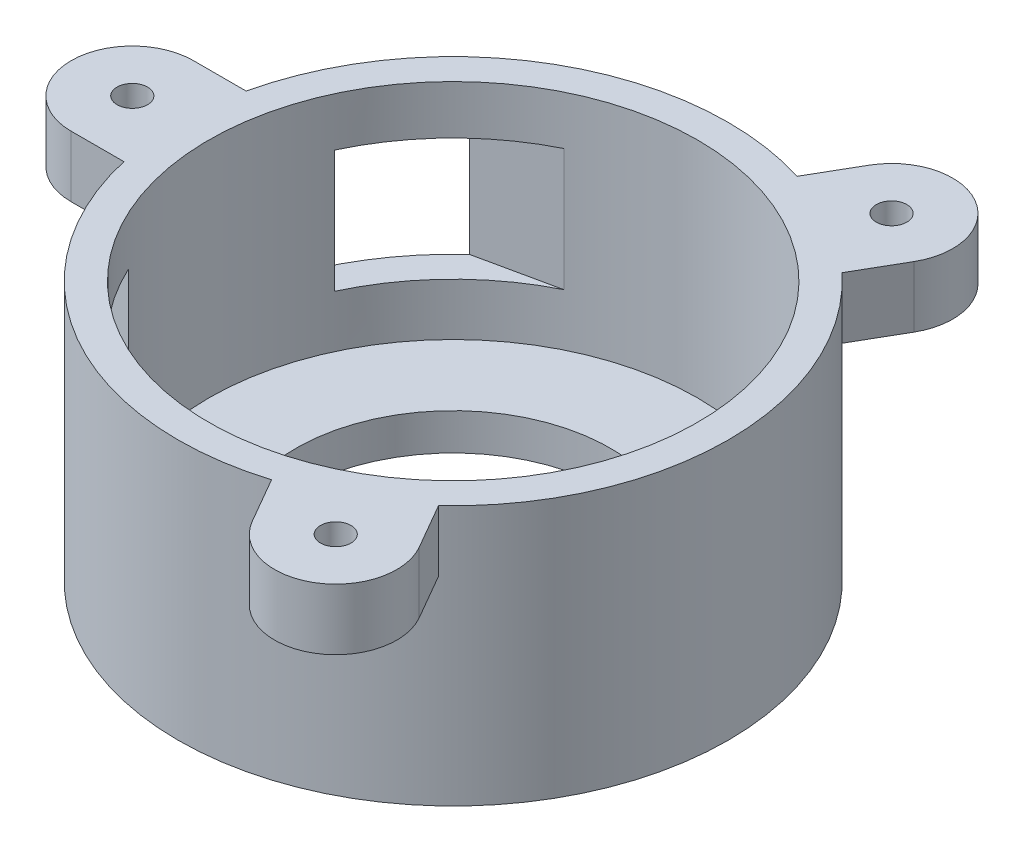
ISO-10303-21;
HEADER;
FILE_DESCRIPTION(('STEP AP214'),'2;1');
FILE_NAME('part.step','',(''),(''),'','','');
FILE_SCHEMA(('AUTOMOTIVE_DESIGN { 1 0 10303 214 1 1 1 1 }'));
ENDSEC;
DATA;
#1=APPLICATION_CONTEXT('core data for automotive mechanical design processes');
#2=APPLICATION_PROTOCOL_DEFINITION('international standard','automotive_design',2000,#1);
#3=PRODUCT_CONTEXT('',#1,'mechanical');
#4=PRODUCT('Part','Part','',(#3));
#5=PRODUCT_RELATED_PRODUCT_CATEGORY('part','',(#4));
#6=PRODUCT_DEFINITION_FORMATION('','',#4);
#7=PRODUCT_DEFINITION_CONTEXT('part definition',#1,'design');
#8=PRODUCT_DEFINITION('design','',#6,#7);
#9=PRODUCT_DEFINITION_SHAPE('','',#8);
#10=(LENGTH_UNIT() NAMED_UNIT(*) SI_UNIT(.MILLI.,.METRE.));
#11=(NAMED_UNIT(*) PLANE_ANGLE_UNIT() SI_UNIT($,.RADIAN.));
#12=(NAMED_UNIT(*) SI_UNIT($,.STERADIAN.) SOLID_ANGLE_UNIT());
#13=UNCERTAINTY_MEASURE_WITH_UNIT(LENGTH_MEASURE(1.E-05),#10,'distance_accuracy_value','');
#14=(GEOMETRIC_REPRESENTATION_CONTEXT(3) GLOBAL_UNCERTAINTY_ASSIGNED_CONTEXT((#13)) GLOBAL_UNIT_ASSIGNED_CONTEXT((#10,
#11,#12)) REPRESENTATION_CONTEXT('',''));
#15=CARTESIAN_POINT('',(0.,0.,0.));
#16=DIRECTION('',(0.,0.,1.));
#17=DIRECTION('',(1.,0.,0.));
#18=AXIS2_PLACEMENT_3D('',#15,#16,#17);
#19=CARTESIAN_POINT('',(-20.,140.,120.));
#20=DIRECTION('',(0.,-1.,0.));
#21=DIRECTION('',(0.,0.,-1.));
#22=AXIS2_PLACEMENT_3D('',#19,#20,#21);
#23=PLANE('',#22);
#24=CARTESIAN_POINT('',(-80.,140.,60.));
#25=DIRECTION('',(0.,1.,0.));
#26=DIRECTION('',(0.,0.,1.));
#27=AXIS2_PLACEMENT_3D('',#24,#25,#26);
#28=CIRCLE('',#27,45.);
#29=CARTESIAN_POINT('',(-66.7228430693652,140.,17.003289616073));
#30=VERTEX_POINT('',#29);
#31=CARTESIAN_POINT('',(-123.874821936961,140.,50.));
#32=VERTEX_POINT('',#31);
#33=EDGE_CURVE('E40',#30,#32,#28,.T.);
#34=ORIENTED_EDGE('',*,*,#33,.T.);
#35=DIRECTION('',(-1.,0.,0.));
#36=VECTOR('',#35,1.);
#37=CARTESIAN_POINT('',(0.,140.,50.));
#38=LINE('',#37,#36);
#39=CARTESIAN_POINT('',(-132.5,140.,50.));
#40=VERTEX_POINT('',#39);
#41=EDGE_CURVE('E212',#32,#40,#38,.T.);
#42=ORIENTED_EDGE('',*,*,#41,.T.);
#43=CARTESIAN_POINT('',(-132.5,140.,60.));
#44=DIRECTION('',(0.,1.,0.));
#45=DIRECTION('',(0.,0.,1.));
#46=AXIS2_PLACEMENT_3D('',#43,#44,#45);
#47=CIRCLE('',#46,9.99999999999999);
#48=CARTESIAN_POINT('',(-132.5,140.,70.));
#49=VERTEX_POINT('',#48);
#50=EDGE_CURVE('E182',#40,#49,#47,.T.);
#51=ORIENTED_EDGE('',*,*,#50,.T.);
#52=DIRECTION('',(-1.,0.,0.));
#53=VECTOR('',#52,1.);
#54=CARTESIAN_POINT('',(0.,140.,70.0000000000001));
#55=LINE('',#54,#53);
#56=CARTESIAN_POINT('',(-123.874821936961,140.,70.));
#57=VERTEX_POINT('',#56);
#58=EDGE_CURVE('E204',#57,#49,#55,.T.);
#59=ORIENTED_EDGE('',*,*,#58,.F.);
#60=CARTESIAN_POINT('',(-66.7228430693627,140.,102.996710383926));
#61=VERTEX_POINT('',#60);
#62=EDGE_CURVE('E721',#57,#61,#28,.T.);
#63=ORIENTED_EDGE('',*,*,#62,.T.);
#64=DIRECTION('',(0.499999999999992,0.,0.866025403784444));
#65=VECTOR('',#64,1.);
#66=CARTESIAN_POINT('',(-94.6410161513764,140.,54.6410161513756));
#67=LINE('',#66,#65);
#68=CARTESIAN_POINT('',(-62.4102540378435,140.,110.466333698682));
#69=VERTEX_POINT('',#68);
#70=EDGE_CURVE('E238',#61,#69,#67,.T.);
#71=ORIENTED_EDGE('',*,*,#70,.T.);
#72=CARTESIAN_POINT('',(-53.7499999999991,140.,105.466333698682));
#73=DIRECTION('',(0.,1.,0.));
#74=DIRECTION('',(0.,0.,1.));
#75=AXIS2_PLACEMENT_3D('',#72,#73,#74);
#76=CIRCLE('',#75,9.99999999999999);
#77=CARTESIAN_POINT('',(-45.0897459621547,140.,100.466333698682));
#78=VERTEX_POINT('',#77);
#79=EDGE_CURVE('E241',#69,#78,#76,.T.);
#80=ORIENTED_EDGE('',*,*,#79,.T.);
#81=DIRECTION('',(0.49999999999999,0.,0.866025403784445));
#82=VECTOR('',#81,1.);
#83=CARTESIAN_POINT('',(-77.3205080756875,140.,44.6410161513756));
#84=LINE('',#83,#82);
#85=CARTESIAN_POINT('',(-49.4023349936742,140.,92.9967103839256));
#86=VERTEX_POINT('',#85);
#87=EDGE_CURVE('E224',#86,#78,#84,.T.);
#88=ORIENTED_EDGE('',*,*,#87,.F.);
#89=CARTESIAN_POINT('',(-49.4023349936762,140.,27.0032896160725));
#90=VERTEX_POINT('',#89);
#91=EDGE_CURVE('E282',#86,#90,#28,.T.);
#92=ORIENTED_EDGE('',*,*,#91,.T.);
#93=DIRECTION('',(0.500000000000004,0.,-0.866025403784437));
#94=VECTOR('',#93,1.);
#95=CARTESIAN_POINT('',(-25.3589838486232,140.,-14.6410161513781));
#96=LINE('',#95,#94);
#97=CARTESIAN_POINT('',(-45.0897459621559,140.,19.5336663013153));
#98=VERTEX_POINT('',#97);
#99=EDGE_CURVE('E271',#90,#98,#96,.T.);
#100=ORIENTED_EDGE('',*,*,#99,.T.);
#101=CARTESIAN_POINT('',(-53.7500000000003,140.,14.5336663013152));
#102=DIRECTION('',(0.,1.,0.));
#103=DIRECTION('',(0.,0.,1.));
#104=AXIS2_PLACEMENT_3D('',#101,#102,#103);
#105=CIRCLE('',#104,9.99999999999999);
#106=CARTESIAN_POINT('',(-62.4102540378447,140.,9.5336663013152));
#107=VERTEX_POINT('',#106);
#108=EDGE_CURVE('E274',#98,#107,#105,.T.);
#109=ORIENTED_EDGE('',*,*,#108,.T.);
#110=DIRECTION('',(0.500000000000005,0.,-0.866025403784436));
#111=VECTOR('',#110,1.);
#112=CARTESIAN_POINT('',(-42.6794919243119,140.,-24.6410161513782));
#113=LINE('',#112,#111);
#114=EDGE_CURVE('E257',#30,#107,#113,.T.);
#115=ORIENTED_EDGE('',*,*,#114,.F.);
#116=EDGE_LOOP('',(#34,#42,#51,#59,#63,#71,#80,#88,#92,#100,#109,#115));
#117=FACE_BOUND('',#116,.T.);
#118=CARTESIAN_POINT('',(-80.,140.,60.));
#119=DIRECTION('',(0.,-1.,0.));
#120=DIRECTION('',(0.,0.,-1.));
#121=AXIS2_PLACEMENT_3D('',#118,#119,#120);
#122=CIRCLE('',#121,40.);
#123=CARTESIAN_POINT('',(-80.,140.,20.));
#124=VERTEX_POINT('',#123);
#125=EDGE_CURVE('E288',#124,#124,#122,.F.);
#126=ORIENTED_EDGE('',*,*,#125,.F.);
#127=EDGE_LOOP('',(#126));
#128=FACE_BOUND('',#127,.T.);
#129=CARTESIAN_POINT('',(-53.7500000000003,140.,14.5336663013152));
#130=DIRECTION('',(0.,1.,0.));
#131=DIRECTION('',(0.,0.,1.));
#132=AXIS2_PLACEMENT_3D('',#129,#130,#131);
#133=CIRCLE('',#132,2.49999999999997);
#134=CARTESIAN_POINT('',(-53.7500000000003,140.,17.0336663013152));
#135=VERTEX_POINT('',#134);
#136=EDGE_CURVE('E248',#135,#135,#133,.T.);
#137=ORIENTED_EDGE('',*,*,#136,.F.);
#138=EDGE_LOOP('',(#137));
#139=FACE_BOUND('',#138,.T.);
#140=CARTESIAN_POINT('',(-53.7499999999991,140.,105.466333698682));
#141=DIRECTION('',(0.,1.,0.));
#142=DIRECTION('',(0.,0.,1.));
#143=AXIS2_PLACEMENT_3D('',#140,#141,#142);
#144=CIRCLE('',#143,2.49999999999999);
#145=CARTESIAN_POINT('',(-53.7499999999991,140.,107.966333698682));
#146=VERTEX_POINT('',#145);
#147=EDGE_CURVE('E217',#146,#146,#144,.T.);
#148=ORIENTED_EDGE('',*,*,#147,.F.);
#149=EDGE_LOOP('',(#148));
#150=FACE_BOUND('',#149,.T.);
#151=CARTESIAN_POINT('',(-132.5,140.,60.));
#152=DIRECTION('',(0.,1.,0.));
#153=DIRECTION('',(0.,0.,1.));
#154=AXIS2_PLACEMENT_3D('',#151,#152,#153);
#155=CIRCLE('',#154,2.49999999999999);
#156=CARTESIAN_POINT('',(-132.5,140.,62.5));
#157=VERTEX_POINT('',#156);
#158=EDGE_CURVE('E209',#157,#157,#155,.T.);
#159=ORIENTED_EDGE('',*,*,#158,.F.);
#160=EDGE_LOOP('',(#159));
#161=FACE_BOUND('',#160,.T.);
#162=ADVANCED_FACE('F37',(#117,#128,#139,#150,#161),#23,.F.);
#163=CARTESIAN_POINT('',(-80.,165.,60.));
#164=DIRECTION('',(0.,-1.,0.));
#165=DIRECTION('',(0.,0.,-1.));
#166=AXIS2_PLACEMENT_3D('',#163,#164,#165);
#167=CYLINDRICAL_SURFACE('',#166,40.);
#168=ORIENTED_EDGE('',*,*,#125,.T.);
#169=EDGE_LOOP('',(#168));
#170=FACE_BOUND('',#169,.T.);
#171=DIRECTION('',(0.,-1.,0.));
#172=VECTOR('',#171,1.);
#173=CARTESIAN_POINT('',(-97.74561888015,165.,24.1518060348856));
#174=LINE('',#173,#172);
#175=CARTESIAN_POINT('',(-97.7456188801501,112.,24.1518060348856));
#176=VERTEX_POINT('',#175);
#177=CARTESIAN_POINT('',(-97.7456188801501,132.,24.1518060348856));
#178=VERTEX_POINT('',#177);
#179=EDGE_CURVE('E344',#176,#178,#174,.F.);
#180=ORIENTED_EDGE('',*,*,#179,.F.);
#181=CARTESIAN_POINT('',(-80.,112.,60.));
#182=DIRECTION('',(0.,1.,0.));
#183=DIRECTION('',(0.,0.,1.));
#184=AXIS2_PLACEMENT_3D('',#181,#182,#183);
#185=CIRCLE('',#184,40.);
#186=CARTESIAN_POINT('',(-116.266630075089,112.,43.1260098673539));
#187=VERTEX_POINT('',#186);
#188=EDGE_CURVE('E347',#187,#176,#185,.F.);
#189=ORIENTED_EDGE('',*,*,#188,.F.);
#190=DIRECTION('',(0.,-1.,0.));
#191=VECTOR('',#190,1.);
#192=CARTESIAN_POINT('',(-116.266630075089,165.,43.1260098673539));
#193=LINE('',#192,#191);
#194=CARTESIAN_POINT('',(-116.266630075089,132.,43.1260098673539));
#195=VERTEX_POINT('',#194);
#196=EDGE_CURVE('E350',#195,#187,#193,.T.);
#197=ORIENTED_EDGE('',*,*,#196,.F.);
#198=CARTESIAN_POINT('',(-80.,132.,60.));
#199=DIRECTION('',(0.,-1.,0.));
#200=DIRECTION('',(0.,0.,-1.));
#201=AXIS2_PLACEMENT_3D('',#198,#199,#200);
#202=CIRCLE('',#201,40.);
#203=EDGE_CURVE('E355',#178,#195,#202,.F.);
#204=ORIENTED_EDGE('',*,*,#203,.F.);
#205=EDGE_LOOP('',(#180,#189,#197,#204));
#206=FACE_BOUND('',#205,.T.);
#207=CARTESIAN_POINT('',(-80.,103.450277264636,60.));
#208=DIRECTION('',(0.,1.,0.));
#209=DIRECTION('',(0.,0.,1.));
#210=AXIS2_PLACEMENT_3D('',#207,#208,#209);
#211=CIRCLE('',#210,40.);
#212=CARTESIAN_POINT('',(-80.,103.450277264636,100.));
#213=VERTEX_POINT('',#212);
#214=EDGE_CURVE('E312',#213,#213,#211,.T.);
#215=ORIENTED_EDGE('',*,*,#214,.F.);
#216=EDGE_LOOP('',(#215));
#217=FACE_BOUND('',#216,.T.);
#218=CARTESIAN_POINT('',(-80.,132.,60.));
#219=DIRECTION('',(0.,-1.,0.));
#220=DIRECTION('',(0.,0.,-1.));
#221=AXIS2_PLACEMENT_3D('',#218,#219,#220);
#222=CIRCLE('',#221,40.);
#223=CARTESIAN_POINT('',(-116.266630075089,132.,76.8739901326458));
#224=VERTEX_POINT('',#223);
#225=CARTESIAN_POINT('',(-97.7456188801504,132.,95.8481939651142));
#226=VERTEX_POINT('',#225);
#227=EDGE_CURVE('E321',#224,#226,#222,.F.);
#228=ORIENTED_EDGE('',*,*,#227,.F.);
#229=DIRECTION('',(0.,-1.,0.));
#230=VECTOR('',#229,1.);
#231=CARTESIAN_POINT('',(-116.266630075089,165.,76.8739901326458));
#232=LINE('',#231,#230);
#233=CARTESIAN_POINT('',(-116.266630075089,112.,76.8739901326458));
#234=VERTEX_POINT('',#233);
#235=EDGE_CURVE('E348',#234,#224,#232,.F.);
#236=ORIENTED_EDGE('',*,*,#235,.F.);
#237=CARTESIAN_POINT('',(-80.,112.,60.));
#238=DIRECTION('',(0.,1.,0.));
#239=DIRECTION('',(0.,0.,1.));
#240=AXIS2_PLACEMENT_3D('',#237,#238,#239);
#241=CIRCLE('',#240,40.);
#242=CARTESIAN_POINT('',(-97.7456188801504,112.,95.8481939651142));
#243=VERTEX_POINT('',#242);
#244=EDGE_CURVE('E325',#243,#234,#241,.F.);
#245=ORIENTED_EDGE('',*,*,#244,.F.);
#246=DIRECTION('',(0.,-1.,0.));
#247=VECTOR('',#246,1.);
#248=CARTESIAN_POINT('',(-97.7456188801504,165.,95.8481939651142));
#249=LINE('',#248,#247);
#250=EDGE_CURVE('E323',#226,#243,#249,.T.);
#251=ORIENTED_EDGE('',*,*,#250,.F.);
#252=EDGE_LOOP('',(#228,#236,#245,#251));
#253=FACE_BOUND('',#252,.T.);
#254=ADVANCED_FACE('F387',(#170,#206,#217,#253),#167,.F.);
#255=CARTESIAN_POINT('',(-80.,160.,60.));
#256=DIRECTION('',(0.,1.,0.));
#257=DIRECTION('',(0.,0.,1.));
#258=AXIS2_PLACEMENT_3D('',#255,#256,#257);
#259=CYLINDRICAL_SURFACE('',#258,45.);
#260=CARTESIAN_POINT('',(-80.,130.,60.));
#261=DIRECTION('',(0.,1.,0.));
#262=DIRECTION('',(0.,0.,1.));
#263=AXIS2_PLACEMENT_3D('',#260,#261,#262);
#264=CIRCLE('',#263,45.);
#265=CARTESIAN_POINT('',(-123.874821936961,130.,50.));
#266=VERTEX_POINT('',#265);
#267=CARTESIAN_POINT('',(-123.874821936961,130.,70.));
#268=VERTEX_POINT('',#267);
#269=EDGE_CURVE('E187',#266,#268,#264,.T.);
#270=ORIENTED_EDGE('',*,*,#269,.F.);
#271=DIRECTION('',(0.,1.,0.));
#272=VECTOR('',#271,1.);
#273=CARTESIAN_POINT('',(-123.874821936961,130.,50.));
#274=LINE('',#273,#272);
#275=EDGE_CURVE('E200',#266,#32,#274,.T.);
#276=ORIENTED_EDGE('',*,*,#275,.T.);
#277=ORIENTED_EDGE('',*,*,#33,.F.);
#278=DIRECTION('',(0.,1.,0.));
#279=VECTOR('',#278,1.);
#280=CARTESIAN_POINT('',(-66.7228430693652,130.,17.003289616073));
#281=LINE('',#280,#279);
#282=CARTESIAN_POINT('',(-66.7228430693652,130.,17.003289616073));
#283=VERTEX_POINT('',#282);
#284=EDGE_CURVE('E283',#283,#30,#281,.T.);
#285=ORIENTED_EDGE('',*,*,#284,.F.);
#286=CARTESIAN_POINT('',(-80.,130.,60.));
#287=DIRECTION('',(0.,1.,0.));
#288=DIRECTION('',(0.,0.,1.));
#289=AXIS2_PLACEMENT_3D('',#286,#287,#288);
#290=CIRCLE('',#289,45.);
#291=CARTESIAN_POINT('',(-49.4023349936762,130.,27.0032896160725));
#292=VERTEX_POINT('',#291);
#293=EDGE_CURVE('E265',#292,#283,#290,.T.);
#294=ORIENTED_EDGE('',*,*,#293,.F.);
#295=DIRECTION('',(0.,1.,0.));
#296=VECTOR('',#295,1.);
#297=CARTESIAN_POINT('',(-49.4023349936762,130.,27.0032896160725));
#298=LINE('',#297,#296);
#299=EDGE_CURVE('E279',#292,#90,#298,.T.);
#300=ORIENTED_EDGE('',*,*,#299,.T.);
#301=ORIENTED_EDGE('',*,*,#91,.F.);
#302=DIRECTION('',(0.,1.,0.));
#303=VECTOR('',#302,1.);
#304=CARTESIAN_POINT('',(-49.4023349936742,130.,92.9967103839256));
#305=LINE('',#304,#303);
#306=CARTESIAN_POINT('',(-49.4023349936742,130.,92.9967103839256));
#307=VERTEX_POINT('',#306);
#308=EDGE_CURVE('E61',#307,#86,#305,.T.);
#309=ORIENTED_EDGE('',*,*,#308,.F.);
#310=CARTESIAN_POINT('',(-80.,130.,60.));
#311=DIRECTION('',(0.,1.,0.));
#312=DIRECTION('',(0.,0.,1.));
#313=AXIS2_PLACEMENT_3D('',#310,#311,#312);
#314=CIRCLE('',#313,45.);
#315=CARTESIAN_POINT('',(-66.7228430693627,130.,102.996710383926));
#316=VERTEX_POINT('',#315);
#317=EDGE_CURVE('E232',#316,#307,#314,.T.);
#318=ORIENTED_EDGE('',*,*,#317,.F.);
#319=DIRECTION('',(0.,1.,0.));
#320=VECTOR('',#319,1.);
#321=CARTESIAN_POINT('',(-66.7228430693627,130.,102.996710383926));
#322=LINE('',#321,#320);
#323=EDGE_CURVE('E245',#316,#61,#322,.T.);
#324=ORIENTED_EDGE('',*,*,#323,.T.);
#325=ORIENTED_EDGE('',*,*,#62,.F.);
#326=DIRECTION('',(0.,1.,0.));
#327=VECTOR('',#326,1.);
#328=CARTESIAN_POINT('',(-123.874821936961,130.,70.));
#329=LINE('',#328,#327);
#330=EDGE_CURVE('E53',#268,#57,#329,.T.);
#331=ORIENTED_EDGE('',*,*,#330,.F.);
#332=EDGE_LOOP('',(#270,#276,#277,#285,#294,#300,#301,#309,#318,#324,#325,#331));
#333=FACE_BOUND('',#332,.T.);
#334=DIRECTION('',(0.,1.,0.));
#335=VECTOR('',#334,1.);
#336=CARTESIAN_POINT('',(-110.465485891167,160.,26.881211232669));
#337=LINE('',#336,#335);
#338=CARTESIAN_POINT('',(-110.465485891167,132.,26.881211232669));
#339=VERTEX_POINT('',#338);
#340=CARTESIAN_POINT('',(-110.465485891167,112.,26.881211232669));
#341=VERTEX_POINT('',#340);
#342=EDGE_CURVE('E300',#339,#341,#337,.F.);
#343=ORIENTED_EDGE('',*,*,#342,.F.);
#344=CARTESIAN_POINT('',(-80.,132.,60.));
#345=DIRECTION('',(0.,-1.,0.));
#346=DIRECTION('',(0.,0.,-1.));
#347=AXIS2_PLACEMENT_3D('',#344,#345,#346);
#348=CIRCLE('',#347,45.);
#349=CARTESIAN_POINT('',(-122.2099652846,132.,44.4013195855259));
#350=VERTEX_POINT('',#349);
#351=EDGE_CURVE('E307',#350,#339,#348,.T.);
#352=ORIENTED_EDGE('',*,*,#351,.F.);
#353=DIRECTION('',(0.,1.,0.));
#354=VECTOR('',#353,1.);
#355=CARTESIAN_POINT('',(-122.2099652846,160.,44.4013195855259));
#356=LINE('',#355,#354);
#357=CARTESIAN_POINT('',(-122.2099652846,112.,44.401319585526));
#358=VERTEX_POINT('',#357);
#359=EDGE_CURVE('E304',#358,#350,#356,.T.);
#360=ORIENTED_EDGE('',*,*,#359,.F.);
#361=CARTESIAN_POINT('',(-80.,112.,60.));
#362=DIRECTION('',(0.,1.,0.));
#363=DIRECTION('',(0.,0.,1.));
#364=AXIS2_PLACEMENT_3D('',#361,#362,#363);
#365=CIRCLE('',#364,45.);
#366=EDGE_CURVE('E302',#341,#358,#365,.T.);
#367=ORIENTED_EDGE('',*,*,#366,.F.);
#368=EDGE_LOOP('',(#343,#352,#360,#367));
#369=FACE_BOUND('',#368,.T.);
#370=CARTESIAN_POINT('',(-80.,97.4502772646362,60.));
#371=DIRECTION('',(0.,1.,0.));
#372=DIRECTION('',(0.,0.,1.));
#373=AXIS2_PLACEMENT_3D('',#370,#371,#372);
#374=CIRCLE('',#373,45.);
#375=CARTESIAN_POINT('',(-80.,97.4502772646362,105.));
#376=VERTEX_POINT('',#375);
#377=EDGE_CURVE('E309',#376,#376,#374,.T.);
#378=ORIENTED_EDGE('',*,*,#377,.T.);
#379=EDGE_LOOP('',(#378));
#380=FACE_BOUND('',#379,.T.);
#381=CARTESIAN_POINT('',(-80.,132.,60.));
#382=DIRECTION('',(0.,-1.,0.));
#383=DIRECTION('',(0.,0.,-1.));
#384=AXIS2_PLACEMENT_3D('',#381,#382,#383);
#385=CIRCLE('',#384,45.);
#386=CARTESIAN_POINT('',(-110.465485891168,132.,93.1187887673307));
#387=VERTEX_POINT('',#386);
#388=CARTESIAN_POINT('',(-122.2099652846,132.,75.5986804144737));
#389=VERTEX_POINT('',#388);
#390=EDGE_CURVE('E291',#387,#389,#385,.T.);
#391=ORIENTED_EDGE('',*,*,#390,.F.);
#392=DIRECTION('',(0.,1.,0.));
#393=VECTOR('',#392,1.);
#394=CARTESIAN_POINT('',(-110.465485891168,160.,93.1187887673307));
#395=LINE('',#394,#393);
#396=CARTESIAN_POINT('',(-110.465485891168,112.,93.1187887673307));
#397=VERTEX_POINT('',#396);
#398=EDGE_CURVE('E294',#397,#387,#395,.T.);
#399=ORIENTED_EDGE('',*,*,#398,.F.);
#400=CARTESIAN_POINT('',(-80.,112.,60.));
#401=DIRECTION('',(0.,1.,0.));
#402=DIRECTION('',(0.,0.,1.));
#403=AXIS2_PLACEMENT_3D('',#400,#401,#402);
#404=CIRCLE('',#403,45.);
#405=CARTESIAN_POINT('',(-122.2099652846,112.,75.5986804144737));
#406=VERTEX_POINT('',#405);
#407=EDGE_CURVE('E296',#406,#397,#404,.T.);
#408=ORIENTED_EDGE('',*,*,#407,.F.);
#409=DIRECTION('',(0.,1.,0.));
#410=VECTOR('',#409,1.);
#411=CARTESIAN_POINT('',(-122.2099652846,160.,75.5986804144737));
#412=LINE('',#411,#410);
#413=EDGE_CURVE('E298',#389,#406,#412,.F.);
#414=ORIENTED_EDGE('',*,*,#413,.F.);
#415=EDGE_LOOP('',(#391,#399,#408,#414));
#416=FACE_BOUND('',#415,.T.);
#417=ADVANCED_FACE('F394',(#333,#369,#380,#416),#259,.T.);
#418=CARTESIAN_POINT('',(0.,97.4502772646362,60.));
#419=DIRECTION('',(0.,-1.,0.));
#420=DIRECTION('',(0.,0.,-1.));
#421=AXIS2_PLACEMENT_3D('',#418,#419,#420);
#422=PLANE('',#421);
#423=CARTESIAN_POINT('',(-80.,97.4502772646362,60.));
#424=DIRECTION('',(0.,1.,0.));
#425=DIRECTION('',(0.,0.,1.));
#426=AXIS2_PLACEMENT_3D('',#423,#424,#425);
#427=CIRCLE('',#426,25.75);
#428=CARTESIAN_POINT('',(-80.,97.4502772646362,85.75));
#429=VERTEX_POINT('',#428);
#430=EDGE_CURVE('E318',#429,#429,#427,.T.);
#431=ORIENTED_EDGE('',*,*,#430,.T.);
#432=EDGE_LOOP('',(#431));
#433=FACE_BOUND('',#432,.T.);
#434=ORIENTED_EDGE('',*,*,#377,.F.);
#435=EDGE_LOOP('',(#434));
#436=FACE_BOUND('',#435,.T.);
#437=ADVANCED_FACE('F477',(#433,#436),#422,.T.);
#438=CARTESIAN_POINT('',(0.,103.450277264636,60.));
#439=DIRECTION('',(0.,1.,0.));
#440=DIRECTION('',(0.,0.,1.));
#441=AXIS2_PLACEMENT_3D('',#438,#439,#440);
#442=PLANE('',#441);
#443=ORIENTED_EDGE('',*,*,#214,.T.);
#444=EDGE_LOOP('',(#443));
#445=FACE_BOUND('',#444,.T.);
#446=CARTESIAN_POINT('',(-80.,103.450277264636,60.));
#447=DIRECTION('',(0.,1.,0.));
#448=DIRECTION('',(0.,0.,1.));
#449=AXIS2_PLACEMENT_3D('',#446,#447,#448);
#450=CIRCLE('',#449,25.75);
#451=CARTESIAN_POINT('',(-80.,103.450277264636,85.75));
#452=VERTEX_POINT('',#451);
#453=EDGE_CURVE('E315',#452,#452,#450,.T.);
#454=ORIENTED_EDGE('',*,*,#453,.F.);
#455=EDGE_LOOP('',(#454));
#456=FACE_BOUND('',#455,.T.);
#457=ADVANCED_FACE('F480',(#445,#456),#442,.T.);
#458=CARTESIAN_POINT('',(-80.,160.,60.));
#459=DIRECTION('',(0.,1.,0.));
#460=DIRECTION('',(0.,0.,1.));
#461=AXIS2_PLACEMENT_3D('',#458,#459,#460);
#462=CYLINDRICAL_SURFACE('',#461,25.75);
#463=ORIENTED_EDGE('',*,*,#430,.F.);
#464=EDGE_LOOP('',(#463));
#465=FACE_BOUND('',#464,.T.);
#466=ORIENTED_EDGE('',*,*,#453,.T.);
#467=EDGE_LOOP('',(#466));
#468=FACE_BOUND('',#467,.T.);
#469=ADVANCED_FACE('F487',(#465,#468),#462,.F.);
#470=CARTESIAN_POINT('',(-125.,132.,0.));
#471=DIRECTION('',(0.,-1.,0.));
#472=DIRECTION('',(0.,0.,-1.));
#473=AXIS2_PLACEMENT_3D('',#470,#471,#472);
#474=PLANE('',#473);
#475=ORIENTED_EDGE('',*,*,#203,.T.);
#476=DIRECTION('',(0.977743800916054,0.,-0.209802430324887));
#477=VECTOR('',#476,1.);
#478=CARTESIAN_POINT('',(-125.,132.,45.));
#479=LINE('',#478,#477);
#480=EDGE_CURVE('E363',#350,#195,#479,.T.);
#481=ORIENTED_EDGE('',*,*,#480,.F.);
#482=ORIENTED_EDGE('',*,*,#351,.T.);
#483=DIRECTION('',(0.977743800916054,0.,-0.209802430324887));
#484=VECTOR('',#483,1.);
#485=CARTESIAN_POINT('',(-125.,132.,30.));
#486=LINE('',#485,#484);
#487=EDGE_CURVE('E354',#339,#178,#486,.T.);
#488=ORIENTED_EDGE('',*,*,#487,.T.);
#489=EDGE_LOOP('',(#475,#481,#482,#488));
#490=FACE_BOUND('',#489,.T.);
#491=ADVANCED_FACE('F490',(#490),#474,.T.);
#492=CARTESIAN_POINT('',(-125.,0.,45.));
#493=DIRECTION('',(-0.209802430324887,0.,-0.977743800916054));
#494=DIRECTION('',(-0.977743800916054,0.,0.209802430324887));
#495=AXIS2_PLACEMENT_3D('',#492,#493,#494);
#496=PLANE('',#495);
#497=ORIENTED_EDGE('',*,*,#196,.T.);
#498=DIRECTION('',(0.977743800916054,0.,-0.209802430324887));
#499=VECTOR('',#498,1.);
#500=CARTESIAN_POINT('',(-125.,112.,45.));
#501=LINE('',#500,#499);
#502=EDGE_CURVE('E366',#358,#187,#501,.T.);
#503=ORIENTED_EDGE('',*,*,#502,.F.);
#504=ORIENTED_EDGE('',*,*,#359,.T.);
#505=ORIENTED_EDGE('',*,*,#480,.T.);
#506=EDGE_LOOP('',(#497,#503,#504,#505));
#507=FACE_BOUND('',#506,.T.);
#508=ADVANCED_FACE('F505',(#507),#496,.T.);
#509=CARTESIAN_POINT('',(-125.,112.,0.));
#510=DIRECTION('',(0.,1.,0.));
#511=DIRECTION('',(0.,0.,1.));
#512=AXIS2_PLACEMENT_3D('',#509,#510,#511);
#513=PLANE('',#512);
#514=ORIENTED_EDGE('',*,*,#188,.T.);
#515=DIRECTION('',(0.977743800916054,0.,-0.209802430324887));
#516=VECTOR('',#515,1.);
#517=CARTESIAN_POINT('',(-125.,112.,30.));
#518=LINE('',#517,#516);
#519=EDGE_CURVE('E351',#341,#176,#518,.T.);
#520=ORIENTED_EDGE('',*,*,#519,.F.);
#521=ORIENTED_EDGE('',*,*,#366,.T.);
#522=ORIENTED_EDGE('',*,*,#502,.T.);
#523=EDGE_LOOP('',(#514,#520,#521,#522));
#524=FACE_BOUND('',#523,.T.);
#525=ADVANCED_FACE('F499',(#524),#513,.T.);
#526=CARTESIAN_POINT('',(-125.,0.,30.));
#527=DIRECTION('',(0.209802430324887,0.,0.977743800916054));
#528=DIRECTION('',(0.977743800916054,0.,-0.209802430324887));
#529=AXIS2_PLACEMENT_3D('',#526,#527,#528);
#530=PLANE('',#529);
#531=ORIENTED_EDGE('',*,*,#179,.T.);
#532=ORIENTED_EDGE('',*,*,#487,.F.);
#533=ORIENTED_EDGE('',*,*,#342,.T.);
#534=ORIENTED_EDGE('',*,*,#519,.T.);
#535=EDGE_LOOP('',(#531,#532,#533,#534));
#536=FACE_BOUND('',#535,.T.);
#537=ADVANCED_FACE('F495',(#536),#530,.T.);
#538=CARTESIAN_POINT('',(-92.9157354766686,132.,126.884581283844));
#539=DIRECTION('',(0.,-1.,0.));
#540=DIRECTION('',(0.,0.,-1.));
#541=AXIS2_PLACEMENT_3D('',#538,#539,#540);
#542=PLANE('',#541);
#543=ORIENTED_EDGE('',*,*,#227,.T.);
#544=DIRECTION('',(-0.977743800916052,0.,-0.209802430324894));
#545=VECTOR('',#544,1.);
#546=CARTESIAN_POINT('',(-80.6077539366316,132.,99.5256048700581));
#547=LINE('',#546,#545);
#548=EDGE_CURVE('E326',#226,#387,#547,.T.);
#549=ORIENTED_EDGE('',*,*,#548,.T.);
#550=ORIENTED_EDGE('',*,*,#390,.T.);
#551=DIRECTION('',(-0.977743800916052,0.,-0.209802430324894));
#552=VECTOR('',#551,1.);
#553=CARTESIAN_POINT('',(-74.4537631666131,132.,85.846116663165));
#554=LINE('',#553,#552);
#555=EDGE_CURVE('E45',#224,#389,#554,.T.);
#556=ORIENTED_EDGE('',*,*,#555,.F.);
#557=EDGE_LOOP('',(#543,#549,#550,#556));
#558=FACE_BOUND('',#557,.T.);
#559=ADVANCED_FACE('F390',(#558),#542,.T.);
#560=CARTESIAN_POINT('',(-80.6077539366316,0.,99.5256048700581));
#561=DIRECTION('',(0.209802430324894,0.,-0.977743800916052));
#562=DIRECTION('',(-0.977743800916052,0.,-0.209802430324894));
#563=AXIS2_PLACEMENT_3D('',#560,#561,#562);
#564=PLANE('',#563);
#565=ORIENTED_EDGE('',*,*,#250,.T.);
#566=DIRECTION('',(-0.977743800916052,0.,-0.209802430324894));
#567=VECTOR('',#566,1.);
#568=CARTESIAN_POINT('',(-80.6077539366316,112.,99.5256048700581));
#569=LINE('',#568,#567);
#570=EDGE_CURVE('E330',#243,#397,#569,.T.);
#571=ORIENTED_EDGE('',*,*,#570,.T.);
#572=ORIENTED_EDGE('',*,*,#398,.T.);
#573=ORIENTED_EDGE('',*,*,#548,.F.);
#574=EDGE_LOOP('',(#565,#571,#572,#573));
#575=FACE_BOUND('',#574,.T.);
#576=ADVANCED_FACE('F392',(#575),#564,.T.);
#577=CARTESIAN_POINT('',(-92.9157354766686,112.,126.884581283844));
#578=DIRECTION('',(0.,1.,0.));
#579=DIRECTION('',(0.,0.,1.));
#580=AXIS2_PLACEMENT_3D('',#577,#578,#579);
#581=PLANE('',#580);
#582=ORIENTED_EDGE('',*,*,#244,.T.);
#583=DIRECTION('',(-0.977743800916052,0.,-0.209802430324894));
#584=VECTOR('',#583,1.);
#585=CARTESIAN_POINT('',(-74.4537631666131,112.,85.846116663165));
#586=LINE('',#585,#584);
#587=EDGE_CURVE('E11',#234,#406,#586,.T.);
#588=ORIENTED_EDGE('',*,*,#587,.T.);
#589=ORIENTED_EDGE('',*,*,#407,.T.);
#590=ORIENTED_EDGE('',*,*,#570,.F.);
#591=EDGE_LOOP('',(#582,#588,#589,#590));
#592=FACE_BOUND('',#591,.T.);
#593=ADVANCED_FACE('F382',(#592),#581,.T.);
#594=CARTESIAN_POINT('',(-74.4537631666131,0.,85.846116663165));
#595=DIRECTION('',(-0.209802430324894,0.,0.977743800916052));
#596=DIRECTION('',(0.977743800916052,0.,0.209802430324894));
#597=AXIS2_PLACEMENT_3D('',#594,#595,#596);
#598=PLANE('',#597);
#599=ORIENTED_EDGE('',*,*,#235,.T.);
#600=ORIENTED_EDGE('',*,*,#555,.T.);
#601=ORIENTED_EDGE('',*,*,#413,.T.);
#602=ORIENTED_EDGE('',*,*,#587,.F.);
#603=EDGE_LOOP('',(#599,#600,#601,#602));
#604=FACE_BOUND('',#603,.T.);
#605=ADVANCED_FACE('F396',(#604),#598,.T.);
#606=CARTESIAN_POINT('',(-25.3589838486232,130.,-14.6410161513781));
#607=DIRECTION('',(0.866025403784437,0.,0.500000000000004));
#608=DIRECTION('',(0.500000000000004,0.,-0.866025403784437));
#609=AXIS2_PLACEMENT_3D('',#606,#607,#608);
#610=PLANE('',#609);
#611=ORIENTED_EDGE('',*,*,#99,.F.);
#612=ORIENTED_EDGE('',*,*,#299,.F.);
#613=DIRECTION('',(0.500000000000004,0.,-0.866025403784437));
#614=VECTOR('',#613,1.);
#615=CARTESIAN_POINT('',(-25.3589838486232,130.,-14.6410161513781));
#616=LINE('',#615,#614);
#617=CARTESIAN_POINT('',(-45.0897459621559,130.,19.5336663013153));
#618=VERTEX_POINT('',#617);
#619=EDGE_CURVE('E256',#292,#618,#616,.T.);
#620=ORIENTED_EDGE('',*,*,#619,.T.);
#621=DIRECTION('',(0.,1.,0.));
#622=VECTOR('',#621,1.);
#623=CARTESIAN_POINT('',(-45.0897459621559,130.,19.5336663013153));
#624=LINE('',#623,#622);
#625=EDGE_CURVE('E268',#618,#98,#624,.T.);
#626=ORIENTED_EDGE('',*,*,#625,.T.);
#627=EDGE_LOOP('',(#611,#612,#620,#626));
#628=FACE_BOUND('',#627,.T.);
#629=ADVANCED_FACE('F398',(#628),#610,.T.);
#630=CARTESIAN_POINT('',(-42.6794919243119,130.,-24.6410161513782));
#631=DIRECTION('',(0.866025403784436,0.,0.500000000000005));
#632=DIRECTION('',(0.500000000000005,0.,-0.866025403784436));
#633=AXIS2_PLACEMENT_3D('',#630,#631,#632);
#634=PLANE('',#633);
#635=ORIENTED_EDGE('',*,*,#114,.T.);
#636=DIRECTION('',(0.,1.,0.));
#637=VECTOR('',#636,1.);
#638=CARTESIAN_POINT('',(-62.4102540378447,130.,9.5336663013152));
#639=LINE('',#638,#637);
#640=CARTESIAN_POINT('',(-62.4102540378447,130.,9.5336663013152));
#641=VERTEX_POINT('',#640);
#642=EDGE_CURVE('E285',#641,#107,#639,.T.);
#643=ORIENTED_EDGE('',*,*,#642,.F.);
#644=DIRECTION('',(0.500000000000005,0.,-0.866025403784436));
#645=VECTOR('',#644,1.);
#646=CARTESIAN_POINT('',(-42.6794919243119,130.,-24.6410161513782));
#647=LINE('',#646,#645);
#648=EDGE_CURVE('E263',#283,#641,#647,.T.);
#649=ORIENTED_EDGE('',*,*,#648,.F.);
#650=ORIENTED_EDGE('',*,*,#284,.T.);
#651=EDGE_LOOP('',(#635,#643,#649,#650));
#652=FACE_BOUND('',#651,.T.);
#653=ADVANCED_FACE('F404',(#652),#634,.F.);
#654=CARTESIAN_POINT('',(-53.7500000000003,130.,14.5336663013152));
#655=DIRECTION('',(0.,1.,0.));
#656=DIRECTION('',(0.,0.,1.));
#657=AXIS2_PLACEMENT_3D('',#654,#655,#656);
#658=CYLINDRICAL_SURFACE('',#657,2.49999999999997);
#659=CARTESIAN_POINT('',(-53.7500000000003,130.,14.5336663013152));
#660=DIRECTION('',(0.,1.,0.));
#661=DIRECTION('',(0.,0.,1.));
#662=AXIS2_PLACEMENT_3D('',#659,#660,#661);
#663=CIRCLE('',#662,2.49999999999997);
#664=CARTESIAN_POINT('',(-53.7500000000003,130.,17.0336663013152));
#665=VERTEX_POINT('',#664);
#666=EDGE_CURVE('E253',#665,#665,#663,.T.);
#667=ORIENTED_EDGE('',*,*,#666,.F.);
#668=EDGE_LOOP('',(#667));
#669=FACE_BOUND('',#668,.T.);
#670=ORIENTED_EDGE('',*,*,#136,.T.);
#671=EDGE_LOOP('',(#670));
#672=FACE_BOUND('',#671,.T.);
#673=ADVANCED_FACE('F469',(#669,#672),#658,.F.);
#674=CARTESIAN_POINT('',(-53.7500000000003,130.,14.5336663013152));
#675=DIRECTION('',(0.,1.,0.));
#676=DIRECTION('',(0.,0.,1.));
#677=AXIS2_PLACEMENT_3D('',#674,#675,#676);
#678=CYLINDRICAL_SURFACE('',#677,9.99999999999999);
#679=ORIENTED_EDGE('',*,*,#108,.F.);
#680=ORIENTED_EDGE('',*,*,#625,.F.);
#681=CARTESIAN_POINT('',(-53.7500000000003,130.,14.5336663013152));
#682=DIRECTION('',(0.,1.,0.));
#683=DIRECTION('',(0.,0.,1.));
#684=AXIS2_PLACEMENT_3D('',#681,#682,#683);
#685=CIRCLE('',#684,9.99999999999999);
#686=EDGE_CURVE('E260',#618,#641,#685,.T.);
#687=ORIENTED_EDGE('',*,*,#686,.T.);
#688=ORIENTED_EDGE('',*,*,#642,.T.);
#689=EDGE_LOOP('',(#679,#680,#687,#688));
#690=FACE_BOUND('',#689,.T.);
#691=ADVANCED_FACE('F465',(#690),#678,.T.);
#692=CARTESIAN_POINT('',(0.,130.,0.));
#693=DIRECTION('',(0.,1.,0.));
#694=DIRECTION('',(0.,0.,1.));
#695=AXIS2_PLACEMENT_3D('',#692,#693,#694);
#696=PLANE('',#695);
#697=ORIENTED_EDGE('',*,*,#666,.T.);
#698=EDGE_LOOP('',(#697));
#699=FACE_BOUND('',#698,.T.);
#700=ORIENTED_EDGE('',*,*,#619,.F.);
#701=ORIENTED_EDGE('',*,*,#293,.T.);
#702=ORIENTED_EDGE('',*,*,#648,.T.);
#703=ORIENTED_EDGE('',*,*,#686,.F.);
#704=EDGE_LOOP('',(#700,#701,#702,#703));
#705=FACE_BOUND('',#704,.T.);
#706=ADVANCED_FACE('F458',(#699,#705),#696,.F.);
#707=CARTESIAN_POINT('',(-94.6410161513764,130.,54.6410161513756));
#708=DIRECTION('',(-0.866025403784444,0.,0.499999999999992));
#709=DIRECTION('',(0.499999999999992,0.,0.866025403784444));
#710=AXIS2_PLACEMENT_3D('',#707,#708,#709);
#711=PLANE('',#710);
#712=ORIENTED_EDGE('',*,*,#70,.F.);
#713=ORIENTED_EDGE('',*,*,#323,.F.);
#714=DIRECTION('',(0.499999999999992,0.,0.866025403784444));
#715=VECTOR('',#714,1.);
#716=CARTESIAN_POINT('',(-94.6410161513764,130.,54.6410161513756));
#717=LINE('',#716,#715);
#718=CARTESIAN_POINT('',(-62.4102540378435,130.,110.466333698682));
#719=VERTEX_POINT('',#718);
#720=EDGE_CURVE('E223',#316,#719,#717,.T.);
#721=ORIENTED_EDGE('',*,*,#720,.T.);
#722=DIRECTION('',(0.,1.,0.));
#723=VECTOR('',#722,1.);
#724=CARTESIAN_POINT('',(-62.4102540378435,130.,110.466333698682));
#725=LINE('',#724,#723);
#726=EDGE_CURVE('E235',#719,#69,#725,.T.);
#727=ORIENTED_EDGE('',*,*,#726,.T.);
#728=EDGE_LOOP('',(#712,#713,#721,#727));
#729=FACE_BOUND('',#728,.T.);
#730=ADVANCED_FACE('F452',(#729),#711,.T.);
#731=CARTESIAN_POINT('',(-77.3205080756875,130.,44.6410161513756));
#732=DIRECTION('',(-0.866025403784445,0.,0.49999999999999));
#733=DIRECTION('',(0.49999999999999,0.,0.866025403784445));
#734=AXIS2_PLACEMENT_3D('',#731,#732,#733);
#735=PLANE('',#734);
#736=ORIENTED_EDGE('',*,*,#87,.T.);
#737=DIRECTION('',(0.,1.,0.));
#738=VECTOR('',#737,1.);
#739=CARTESIAN_POINT('',(-45.0897459621547,130.,100.466333698682));
#740=LINE('',#739,#738);
#741=CARTESIAN_POINT('',(-45.0897459621547,130.,100.466333698682));
#742=VERTEX_POINT('',#741);
#743=EDGE_CURVE('E250',#742,#78,#740,.T.);
#744=ORIENTED_EDGE('',*,*,#743,.F.);
#745=DIRECTION('',(0.49999999999999,0.,0.866025403784445));
#746=VECTOR('',#745,1.);
#747=CARTESIAN_POINT('',(-77.3205080756875,130.,44.6410161513756));
#748=LINE('',#747,#746);
#749=EDGE_CURVE('E230',#307,#742,#748,.T.);
#750=ORIENTED_EDGE('',*,*,#749,.F.);
#751=ORIENTED_EDGE('',*,*,#308,.T.);
#752=EDGE_LOOP('',(#736,#744,#750,#751));
#753=FACE_BOUND('',#752,.T.);
#754=ADVANCED_FACE('F448',(#753),#735,.F.);
#755=CARTESIAN_POINT('',(-53.7499999999991,130.,105.466333698682));
#756=DIRECTION('',(0.,1.,0.));
#757=DIRECTION('',(0.,0.,1.));
#758=AXIS2_PLACEMENT_3D('',#755,#756,#757);
#759=CYLINDRICAL_SURFACE('',#758,2.49999999999999);
#760=CARTESIAN_POINT('',(-53.7499999999991,130.,105.466333698682));
#761=DIRECTION('',(0.,1.,0.));
#762=DIRECTION('',(0.,0.,1.));
#763=AXIS2_PLACEMENT_3D('',#760,#761,#762);
#764=CIRCLE('',#763,2.49999999999999);
#765=CARTESIAN_POINT('',(-53.7499999999991,130.,107.966333698682));
#766=VERTEX_POINT('',#765);
#767=EDGE_CURVE('E220',#766,#766,#764,.T.);
#768=ORIENTED_EDGE('',*,*,#767,.F.);
#769=EDGE_LOOP('',(#768));
#770=FACE_BOUND('',#769,.T.);
#771=ORIENTED_EDGE('',*,*,#147,.T.);
#772=EDGE_LOOP('',(#771));
#773=FACE_BOUND('',#772,.T.);
#774=ADVANCED_FACE('F451',(#770,#773),#759,.F.);
#775=CARTESIAN_POINT('',(-53.7499999999991,130.,105.466333698682));
#776=DIRECTION('',(0.,1.,0.));
#777=DIRECTION('',(0.,0.,1.));
#778=AXIS2_PLACEMENT_3D('',#775,#776,#777);
#779=CYLINDRICAL_SURFACE('',#778,9.99999999999999);
#780=ORIENTED_EDGE('',*,*,#79,.F.);
#781=ORIENTED_EDGE('',*,*,#726,.F.);
#782=CARTESIAN_POINT('',(-53.7499999999991,130.,105.466333698682));
#783=DIRECTION('',(0.,1.,0.));
#784=DIRECTION('',(0.,0.,1.));
#785=AXIS2_PLACEMENT_3D('',#782,#783,#784);
#786=CIRCLE('',#785,9.99999999999999);
#787=EDGE_CURVE('E227',#719,#742,#786,.T.);
#788=ORIENTED_EDGE('',*,*,#787,.T.);
#789=ORIENTED_EDGE('',*,*,#743,.T.);
#790=EDGE_LOOP('',(#780,#781,#788,#789));
#791=FACE_BOUND('',#790,.T.);
#792=ADVANCED_FACE('F446',(#791),#779,.T.);
#793=CARTESIAN_POINT('',(0.,130.,0.));
#794=DIRECTION('',(0.,1.,0.));
#795=DIRECTION('',(0.,0.,1.));
#796=AXIS2_PLACEMENT_3D('',#793,#794,#795);
#797=PLANE('',#796);
#798=ORIENTED_EDGE('',*,*,#767,.T.);
#799=EDGE_LOOP('',(#798));
#800=FACE_BOUND('',#799,.T.);
#801=ORIENTED_EDGE('',*,*,#720,.F.);
#802=ORIENTED_EDGE('',*,*,#317,.T.);
#803=ORIENTED_EDGE('',*,*,#749,.T.);
#804=ORIENTED_EDGE('',*,*,#787,.F.);
#805=EDGE_LOOP('',(#801,#802,#803,#804));
#806=FACE_BOUND('',#805,.T.);
#807=ADVANCED_FACE('F443',(#800,#806),#797,.F.);
#808=CARTESIAN_POINT('',(0.,130.,50.));
#809=DIRECTION('',(0.,0.,-1.));
#810=DIRECTION('',(-1.,0.,0.));
#811=AXIS2_PLACEMENT_3D('',#808,#809,#810);
#812=PLANE('',#811);
#813=ORIENTED_EDGE('',*,*,#41,.F.);
#814=ORIENTED_EDGE('',*,*,#275,.F.);
#815=DIRECTION('',(-1.,0.,0.));
#816=VECTOR('',#815,1.);
#817=CARTESIAN_POINT('',(0.,130.,50.));
#818=LINE('',#817,#816);
#819=CARTESIAN_POINT('',(-132.5,130.,50.));
#820=VERTEX_POINT('',#819);
#821=EDGE_CURVE('E193',#266,#820,#818,.T.);
#822=ORIENTED_EDGE('',*,*,#821,.T.);
#823=DIRECTION('',(0.,1.,0.));
#824=VECTOR('',#823,1.);
#825=CARTESIAN_POINT('',(-132.5,130.,50.));
#826=LINE('',#825,#824);
#827=EDGE_CURVE('E177',#820,#40,#826,.T.);
#828=ORIENTED_EDGE('',*,*,#827,.T.);
#829=EDGE_LOOP('',(#813,#814,#822,#828));
#830=FACE_BOUND('',#829,.T.);
#831=ADVANCED_FACE('F198',(#830),#812,.T.);
#832=CARTESIAN_POINT('',(0.,130.,70.0000000000001));
#833=DIRECTION('',(0.,0.,-1.));
#834=DIRECTION('',(-1.,0.,0.));
#835=AXIS2_PLACEMENT_3D('',#832,#833,#834);
#836=PLANE('',#835);
#837=ORIENTED_EDGE('',*,*,#58,.T.);
#838=DIRECTION('',(0.,1.,0.));
#839=VECTOR('',#838,1.);
#840=CARTESIAN_POINT('',(-132.5,130.,70.));
#841=LINE('',#840,#839);
#842=CARTESIAN_POINT('',(-132.5,130.,70.));
#843=VERTEX_POINT('',#842);
#844=EDGE_CURVE('E186',#843,#49,#841,.T.);
#845=ORIENTED_EDGE('',*,*,#844,.F.);
#846=DIRECTION('',(-1.,0.,0.));
#847=VECTOR('',#846,1.);
#848=CARTESIAN_POINT('',(0.,130.,70.0000000000001));
#849=LINE('',#848,#847);
#850=EDGE_CURVE('E195',#268,#843,#849,.T.);
#851=ORIENTED_EDGE('',*,*,#850,.F.);
#852=ORIENTED_EDGE('',*,*,#330,.T.);
#853=EDGE_LOOP('',(#837,#845,#851,#852));
#854=FACE_BOUND('',#853,.T.);
#855=ADVANCED_FACE('F431',(#854),#836,.F.);
#856=CARTESIAN_POINT('',(-132.5,130.,60.));
#857=DIRECTION('',(0.,1.,0.));
#858=DIRECTION('',(0.,0.,1.));
#859=AXIS2_PLACEMENT_3D('',#856,#857,#858);
#860=CYLINDRICAL_SURFACE('',#859,2.49999999999999);
#861=CARTESIAN_POINT('',(-132.5,130.,60.));
#862=DIRECTION('',(0.,1.,0.));
#863=DIRECTION('',(0.,0.,1.));
#864=AXIS2_PLACEMENT_3D('',#861,#862,#863);
#865=CIRCLE('',#864,2.49999999999999);
#866=CARTESIAN_POINT('',(-132.5,130.,62.5));
#867=VERTEX_POINT('',#866);
#868=EDGE_CURVE('E201',#867,#867,#865,.T.);
#869=ORIENTED_EDGE('',*,*,#868,.F.);
#870=EDGE_LOOP('',(#869));
#871=FACE_BOUND('',#870,.T.);
#872=ORIENTED_EDGE('',*,*,#158,.T.);
#873=EDGE_LOOP('',(#872));
#874=FACE_BOUND('',#873,.T.);
#875=ADVANCED_FACE('F429',(#871,#874),#860,.F.);
#876=CARTESIAN_POINT('',(-132.5,130.,60.));
#877=DIRECTION('',(0.,1.,0.));
#878=DIRECTION('',(0.,0.,1.));
#879=AXIS2_PLACEMENT_3D('',#876,#877,#878);
#880=CYLINDRICAL_SURFACE('',#879,9.99999999999999);
#881=ORIENTED_EDGE('',*,*,#50,.F.);
#882=ORIENTED_EDGE('',*,*,#827,.F.);
#883=CARTESIAN_POINT('',(-132.5,130.,60.));
#884=DIRECTION('',(0.,1.,0.));
#885=DIRECTION('',(0.,0.,1.));
#886=AXIS2_PLACEMENT_3D('',#883,#884,#885);
#887=CIRCLE('',#886,9.99999999999999);
#888=EDGE_CURVE('E180',#820,#843,#887,.T.);
#889=ORIENTED_EDGE('',*,*,#888,.T.);
#890=ORIENTED_EDGE('',*,*,#844,.T.);
#891=EDGE_LOOP('',(#881,#882,#889,#890));
#892=FACE_BOUND('',#891,.T.);
#893=ADVANCED_FACE('F179',(#892),#880,.T.);
#894=CARTESIAN_POINT('',(0.,130.,0.));
#895=DIRECTION('',(0.,1.,0.));
#896=DIRECTION('',(0.,0.,1.));
#897=AXIS2_PLACEMENT_3D('',#894,#895,#896);
#898=PLANE('',#897);
#899=ORIENTED_EDGE('',*,*,#868,.T.);
#900=EDGE_LOOP('',(#899));
#901=FACE_BOUND('',#900,.T.);
#902=ORIENTED_EDGE('',*,*,#821,.F.);
#903=ORIENTED_EDGE('',*,*,#269,.T.);
#904=ORIENTED_EDGE('',*,*,#850,.T.);
#905=ORIENTED_EDGE('',*,*,#888,.F.);
#906=EDGE_LOOP('',(#902,#903,#904,#905));
#907=FACE_BOUND('',#906,.T.);
#908=ADVANCED_FACE('F191',(#901,#907),#898,.F.);
#909=CLOSED_SHELL('',(#162,#254,#417,#437,#457,#469,#491,#508,#525,#537,#559,#576,#593,#605,
#629,#653,#673,#691,#706,#730,#754,#774,#792,#807,#831,#855,#875,#893,#908));
#910=MANIFOLD_SOLID_BREP('B2',#909);
#911=ADVANCED_BREP_SHAPE_REPRESENTATION('',(#18,#910),#14);
#912=SHAPE_DEFINITION_REPRESENTATION(#9,#911);
ENDSEC;
END-ISO-10303-21;
